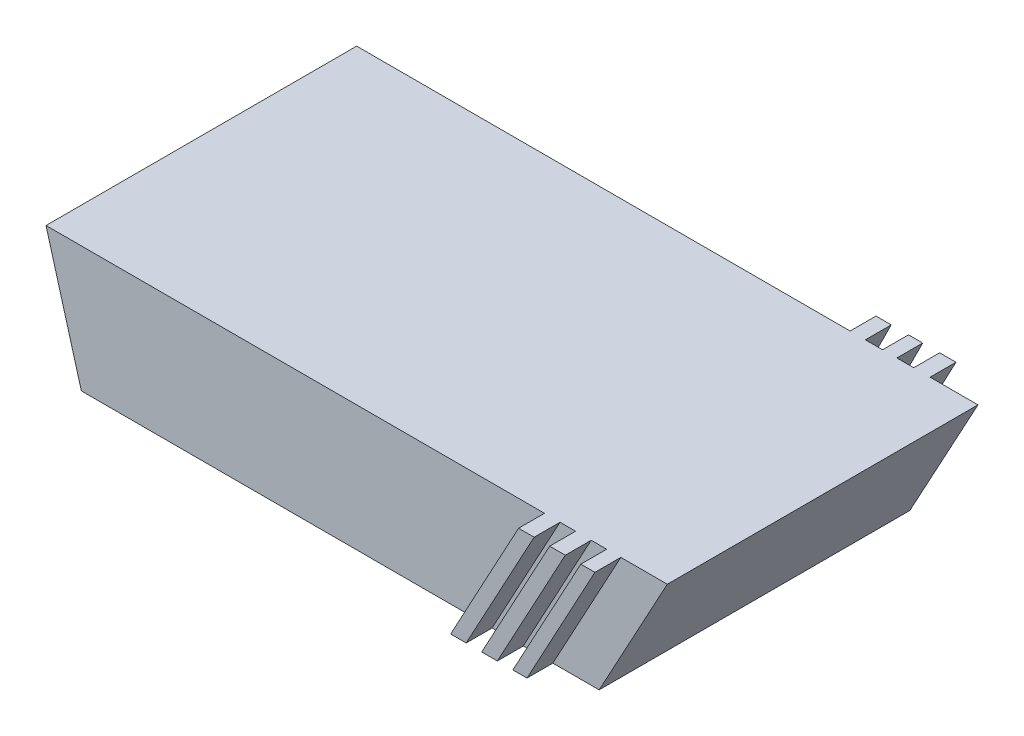
ISO-10303-21;
HEADER;
FILE_DESCRIPTION(('STEP AP214'),'2;1');
FILE_NAME('part.step','',(''),(''),'','','');
FILE_SCHEMA(('AUTOMOTIVE_DESIGN { 1 0 10303 214 1 1 1 1 }'));
ENDSEC;
DATA;
#1=APPLICATION_CONTEXT('core data for automotive mechanical design processes');
#2=APPLICATION_PROTOCOL_DEFINITION('international standard','automotive_design',2000,#1);
#3=PRODUCT_CONTEXT('',#1,'mechanical');
#4=PRODUCT('Part','Part','',(#3));
#5=PRODUCT_RELATED_PRODUCT_CATEGORY('part','',(#4));
#6=PRODUCT_DEFINITION_FORMATION('','',#4);
#7=PRODUCT_DEFINITION_CONTEXT('part definition',#1,'design');
#8=PRODUCT_DEFINITION('design','',#6,#7);
#9=PRODUCT_DEFINITION_SHAPE('','',#8);
#10=(LENGTH_UNIT() NAMED_UNIT(*) SI_UNIT(.MILLI.,.METRE.));
#11=(NAMED_UNIT(*) PLANE_ANGLE_UNIT() SI_UNIT($,.RADIAN.));
#12=(NAMED_UNIT(*) SI_UNIT($,.STERADIAN.) SOLID_ANGLE_UNIT());
#13=UNCERTAINTY_MEASURE_WITH_UNIT(LENGTH_MEASURE(1.E-05),#10,'distance_accuracy_value','');
#14=(GEOMETRIC_REPRESENTATION_CONTEXT(3) GLOBAL_UNCERTAINTY_ASSIGNED_CONTEXT((#13)) GLOBAL_UNIT_ASSIGNED_CONTEXT((#10,
#11,#12)) REPRESENTATION_CONTEXT('',''));
#15=CARTESIAN_POINT('',(0.,0.,0.));
#16=DIRECTION('',(0.,0.,1.));
#17=DIRECTION('',(1.,0.,0.));
#18=AXIS2_PLACEMENT_3D('',#15,#16,#17);
#19=CARTESIAN_POINT('',(0.,0.,0.));
#20=DIRECTION('',(0.,0.,1.));
#21=DIRECTION('',(1.,0.,0.));
#22=AXIS2_PLACEMENT_3D('',#19,#20,#21);
#23=PLANE('',#22);
#24=DIRECTION('',(0.455899375493308,0.890031324968291,0.));
#25=VECTOR('',#24,1.);
#26=CARTESIAN_POINT('',(149.796923604426,-76.7302475837124,0.));
#27=LINE('',#26,#25);
#28=CARTESIAN_POINT('',(174.135626677359,-29.2149200608947,0.));
#29=VERTEX_POINT('',#28);
#30=CARTESIAN_POINT('',(205.699290691626,32.4053654967997,0.));
#31=VERTEX_POINT('',#30);
#32=EDGE_CURVE('E569',#29,#31,#27,.T.);
#33=ORIENTED_EDGE('',*,*,#32,.F.);
#34=DIRECTION('',(1.,0.,0.));
#35=VECTOR('',#34,1.);
#36=CARTESIAN_POINT('',(-50.2295122342389,-29.2149200608947,0.));
#37=LINE('',#36,#35);
#38=CARTESIAN_POINT('',(166.529193842421,-29.2149200608947,0.));
#39=VERTEX_POINT('',#38);
#40=EDGE_CURVE('E319',#39,#29,#37,.T.);
#41=ORIENTED_EDGE('',*,*,#40,.F.);
#42=DIRECTION('',(-0.447954525543773,-0.894056342209401,0.));
#43=VECTOR('',#42,1.);
#44=CARTESIAN_POINT('',(144.813379131163,-72.5567343784887,0.));
#45=LINE('',#44,#43);
#46=CARTESIAN_POINT('',(197.403182961111,32.4053654967997,0.));
#47=VERTEX_POINT('',#46);
#48=EDGE_CURVE('E320',#47,#39,#45,.T.);
#49=ORIENTED_EDGE('',*,*,#48,.F.);
#50=DIRECTION('',(-1.,0.,0.));
#51=VECTOR('',#50,1.);
#52=CARTESIAN_POINT('',(-67.5778080595251,32.4053654967997,0.));
#53=LINE('',#52,#51);
#54=EDGE_CURVE('E393',#31,#47,#53,.T.);
#55=ORIENTED_EDGE('',*,*,#54,.F.);
#56=EDGE_LOOP('',(#33,#41,#49,#55));
#57=FACE_BOUND('',#56,.T.);
#58=ADVANCED_FACE('F109',(#57),#23,.F.);
#59=CARTESIAN_POINT('',(181.065122105022,-29.2149200608947,0.));
#60=VERTEX_POINT('',#59);
#61=CARTESIAN_POINT('',(203.770487765761,-29.2149200608947,0.));
#62=VERTEX_POINT('',#61);
#63=EDGE_CURVE('E113',#60,#62,#37,.T.);
#64=ORIENTED_EDGE('',*,*,#63,.F.);
#65=DIRECTION('',(0.46813038929932,0.883659401927274,0.));
#66=VECTOR('',#65,1.);
#67=CARTESIAN_POINT('',(153.470686029579,-81.3031489738773,0.));
#68=LINE('',#67,#66);
#69=CARTESIAN_POINT('',(213.709292702816,32.4053654967997,0.));
#70=VERTEX_POINT('',#69);
#71=EDGE_CURVE('E312',#60,#70,#68,.T.);
#72=ORIENTED_EDGE('',*,*,#71,.T.);
#73=CARTESIAN_POINT('',(237.222191940475,32.4053654967997,0.));
#74=VERTEX_POINT('',#73);
#75=EDGE_CURVE('E406',#74,#70,#53,.T.);
#76=ORIENTED_EDGE('',*,*,#75,.F.);
#77=DIRECTION('',(0.47709948611595,0.878849293307958,0.));
#78=VECTOR('',#77,1.);
#79=CARTESIAN_POINT('',(203.770487765761,-29.2149200608947,0.));
#80=LINE('',#79,#78);
#81=EDGE_CURVE('E398',#62,#74,#80,.T.);
#82=ORIENTED_EDGE('',*,*,#81,.F.);
#83=EDGE_LOOP('',(#64,#72,#76,#82));
#84=FACE_BOUND('',#83,.T.);
#85=ADVANCED_FACE('F555',(#84),#23,.F.);
#86=DIRECTION('',(0.455899375493308,0.890031324968291,0.));
#87=VECTOR('',#86,1.);
#88=CARTESIAN_POINT('',(137.698216372376,-70.5329454027311,0.));
#89=LINE('',#88,#87);
#90=CARTESIAN_POINT('',(158.86248488914,-29.2149200608947,0.));
#91=VERTEX_POINT('',#90);
#92=CARTESIAN_POINT('',(190.426148903407,32.4053654967997,0.));
#93=VERTEX_POINT('',#92);
#94=EDGE_CURVE('E322',#91,#93,#89,.T.);
#95=ORIENTED_EDGE('',*,*,#94,.F.);
#96=CARTESIAN_POINT('',(151.231941606863,-29.2149200608947,0.));
#97=VERTEX_POINT('',#96);
#98=EDGE_CURVE('E366',#97,#91,#37,.T.);
#99=ORIENTED_EDGE('',*,*,#98,.F.);
#100=DIRECTION('',(-0.446331631424027,-0.894867629758931,0.));
#101=VECTOR('',#100,1.);
#102=CARTESIAN_POINT('',(132.773400243496,-66.2231668345845,0.));
#103=LINE('',#102,#101);
#104=CARTESIAN_POINT('',(181.966188401766,32.4053654967997,0.));
#105=VERTEX_POINT('',#104);
#106=EDGE_CURVE('E346',#105,#97,#103,.T.);
#107=ORIENTED_EDGE('',*,*,#106,.F.);
#108=EDGE_CURVE('E390',#93,#105,#53,.T.);
#109=ORIENTED_EDGE('',*,*,#108,.F.);
#110=EDGE_LOOP('',(#95,#99,#107,#109));
#111=FACE_BOUND('',#110,.T.);
#112=ADVANCED_FACE('F591',(#111),#23,.F.);
#113=DIRECTION('',(0.447954525543774,0.894056342209401,0.));
#114=VECTOR('',#113,1.);
#115=CARTESIAN_POINT('',(126.494777369655,-63.3784531301023,0.));
#116=LINE('',#115,#114);
#117=CARTESIAN_POINT('',(143.611941606863,-29.2149200608947,0.));
#118=VERTEX_POINT('',#117);
#119=CARTESIAN_POINT('',(174.485930725553,32.4053654967997,0.));
#120=VERTEX_POINT('',#119);
#121=EDGE_CURVE('E351',#118,#120,#116,.T.);
#122=ORIENTED_EDGE('',*,*,#121,.F.);
#123=CARTESIAN_POINT('',(-50.2295122342389,-29.2149200608947,0.));
#124=VERTEX_POINT('',#123);
#125=EDGE_CURVE('E541',#124,#118,#37,.T.);
#126=ORIENTED_EDGE('',*,*,#125,.F.);
#127=DIRECTION('',(0.271000208820652,-0.962579288588303,0.));
#128=VECTOR('',#127,1.);
#129=CARTESIAN_POINT('',(-67.5778080595251,32.4053654967997,0.));
#130=LINE('',#129,#128);
#131=CARTESIAN_POINT('',(-67.5778080595251,32.4053654967997,0.));
#132=VERTEX_POINT('',#131);
#133=EDGE_CURVE('E438',#132,#124,#130,.T.);
#134=ORIENTED_EDGE('',*,*,#133,.F.);
#135=EDGE_CURVE('E394',#120,#132,#53,.T.);
#136=ORIENTED_EDGE('',*,*,#135,.F.);
#137=EDGE_LOOP('',(#122,#126,#134,#136));
#138=FACE_BOUND('',#137,.T.);
#139=ADVANCED_FACE('F605',(#138),#23,.F.);
#140=CARTESIAN_POINT('',(0.,0.,152.4));
#141=DIRECTION('',(0.,0.,1.));
#142=DIRECTION('',(1.,0.,0.));
#143=AXIS2_PLACEMENT_3D('',#140,#141,#142);
#144=PLANE('',#143);
#145=DIRECTION('',(-1.,0.,0.));
#146=VECTOR('',#145,1.);
#147=CARTESIAN_POINT('',(-67.5778080595251,32.4053654967997,152.4));
#148=LINE('',#147,#146);
#149=CARTESIAN_POINT('',(192.204880740534,32.4053654967997,152.4));
#150=VERTEX_POINT('',#149);
#151=CARTESIAN_POINT('',(184.574337458257,32.4053654967997,152.4));
#152=VERTEX_POINT('',#151);
#153=EDGE_CURVE('E431',#150,#152,#148,.T.);
#154=ORIENTED_EDGE('',*,*,#153,.T.);
#155=DIRECTION('',(0.475894014218418,0.879502636284327,0.));
#156=VECTOR('',#155,1.);
#157=CARTESIAN_POINT('',(151.231941606864,-29.2149200608947,152.4));
#158=LINE('',#157,#156);
#159=CARTESIAN_POINT('',(151.231941606864,-29.2149200608947,152.4));
#160=VERTEX_POINT('',#159);
#161=EDGE_CURVE('E377',#160,#152,#158,.T.);
#162=ORIENTED_EDGE('',*,*,#161,.F.);
#163=DIRECTION('',(1.,0.,0.));
#164=VECTOR('',#163,1.);
#165=CARTESIAN_POINT('',(-50.2295122342389,-29.2149200608947,152.4));
#166=LINE('',#165,#164);
#167=CARTESIAN_POINT('',(158.86248488914,-29.2149200608947,152.4));
#168=VERTEX_POINT('',#167);
#169=EDGE_CURVE('E410',#160,#168,#166,.T.);
#170=ORIENTED_EDGE('',*,*,#169,.T.);
#171=DIRECTION('',(-0.475894014218417,-0.879502636284327,0.));
#172=VECTOR('',#171,1.);
#173=CARTESIAN_POINT('',(192.204880740534,32.4053654967997,152.4));
#174=LINE('',#173,#172);
#175=EDGE_CURVE('E469',#150,#168,#174,.T.);
#176=ORIENTED_EDGE('',*,*,#175,.F.);
#177=EDGE_LOOP('',(#154,#162,#170,#176));
#178=FACE_BOUND('',#177,.T.);
#179=ADVANCED_FACE('F607',(#178),#144,.T.);
#180=CARTESIAN_POINT('',(-50.2295122342389,-29.2149200608947,152.4));
#181=VERTEX_POINT('',#180);
#182=CARTESIAN_POINT('',(143.611941606864,-29.2149200608947,152.4));
#183=VERTEX_POINT('',#182);
#184=EDGE_CURVE('E413',#181,#183,#166,.T.);
#185=ORIENTED_EDGE('',*,*,#184,.T.);
#186=DIRECTION('',(-0.475894014218418,-0.879502636284327,0.));
#187=VECTOR('',#186,1.);
#188=CARTESIAN_POINT('',(143.611941606864,-29.2149200608947,152.4));
#189=LINE('',#188,#187);
#190=CARTESIAN_POINT('',(176.954337458257,32.4053654967997,152.4));
#191=VERTEX_POINT('',#190);
#192=EDGE_CURVE('E912',#191,#183,#189,.T.);
#193=ORIENTED_EDGE('',*,*,#192,.F.);
#194=CARTESIAN_POINT('',(-67.5778080595251,32.4053654967997,152.4));
#195=VERTEX_POINT('',#194);
#196=EDGE_CURVE('E415',#191,#195,#148,.T.);
#197=ORIENTED_EDGE('',*,*,#196,.T.);
#198=DIRECTION('',(0.271000208820652,-0.962579288588303,0.));
#199=VECTOR('',#198,1.);
#200=CARTESIAN_POINT('',(-67.5778080595251,32.4053654967997,152.4));
#201=LINE('',#200,#199);
#202=EDGE_CURVE('E409',#195,#181,#201,.T.);
#203=ORIENTED_EDGE('',*,*,#202,.T.);
#204=EDGE_LOOP('',(#185,#193,#197,#203));
#205=FACE_BOUND('',#204,.T.);
#206=ADVANCED_FACE('F533',(#205),#144,.T.);
#207=CARTESIAN_POINT('',(207.478022528753,32.4053654967997,152.4));
#208=VERTEX_POINT('',#207);
#209=CARTESIAN_POINT('',(199.871589693814,32.4053654967997,152.4));
#210=VERTEX_POINT('',#209);
#211=EDGE_CURVE('E433',#208,#210,#148,.T.);
#212=ORIENTED_EDGE('',*,*,#211,.T.);
#213=DIRECTION('',(0.475894014218417,0.879502636284327,0.));
#214=VECTOR('',#213,1.);
#215=CARTESIAN_POINT('',(166.529193842421,-29.2149200608947,152.4));
#216=LINE('',#215,#214);
#217=CARTESIAN_POINT('',(166.529193842421,-29.2149200608947,152.4));
#218=VERTEX_POINT('',#217);
#219=EDGE_CURVE('E454',#218,#210,#216,.T.);
#220=ORIENTED_EDGE('',*,*,#219,.F.);
#221=CARTESIAN_POINT('',(174.135626677359,-29.2149200608947,152.4));
#222=VERTEX_POINT('',#221);
#223=EDGE_CURVE('E414',#218,#222,#166,.T.);
#224=ORIENTED_EDGE('',*,*,#223,.T.);
#225=DIRECTION('',(-0.475894014218417,-0.879502636284327,0.));
#226=VECTOR('',#225,1.);
#227=CARTESIAN_POINT('',(207.478022528753,32.4053654967997,152.4));
#228=LINE('',#227,#226);
#229=EDGE_CURVE('E457',#208,#222,#228,.T.);
#230=ORIENTED_EDGE('',*,*,#229,.F.);
#231=EDGE_LOOP('',(#212,#220,#224,#230));
#232=FACE_BOUND('',#231,.T.);
#233=ADVANCED_FACE('F453',(#232),#144,.T.);
#234=CARTESIAN_POINT('',(-67.5778080595251,32.4053654967997,152.4));
#235=DIRECTION('',(0.962579288588303,0.271000208820652,0.));
#236=DIRECTION('',(-0.271000208820652,0.962579288588303,0.));
#237=AXIS2_PLACEMENT_3D('',#234,#235,#236);
#238=PLANE('',#237);
#239=ORIENTED_EDGE('',*,*,#133,.T.);
#240=DIRECTION('',(0.,0.,-1.));
#241=VECTOR('',#240,1.);
#242=CARTESIAN_POINT('',(-50.2295122342389,-29.2149200608947,152.4));
#243=LINE('',#242,#241);
#244=EDGE_CURVE('E12',#181,#124,#243,.T.);
#245=ORIENTED_EDGE('',*,*,#244,.F.);
#246=ORIENTED_EDGE('',*,*,#202,.F.);
#247=DIRECTION('',(0.,0.,-1.));
#248=VECTOR('',#247,1.);
#249=CARTESIAN_POINT('',(-67.5778080595251,32.4053654967997,152.4));
#250=LINE('',#249,#248);
#251=EDGE_CURVE('E399',#195,#132,#250,.T.);
#252=ORIENTED_EDGE('',*,*,#251,.T.);
#253=EDGE_LOOP('',(#239,#245,#246,#252));
#254=FACE_BOUND('',#253,.T.);
#255=ADVANCED_FACE('F111',(#254),#238,.F.);
#256=CARTESIAN_POINT('',(-50.2295122342389,-29.2149200608947,152.4));
#257=DIRECTION('',(0.,1.,0.));
#258=DIRECTION('',(0.,0.,1.));
#259=AXIS2_PLACEMENT_3D('',#256,#257,#258);
#260=PLANE('',#259);
#261=ORIENTED_EDGE('',*,*,#125,.T.);
#262=DIRECTION('',(0.,0.,1.));
#263=VECTOR('',#262,1.);
#264=CARTESIAN_POINT('',(143.611941606863,-29.2149200608947,-12.7));
#265=LINE('',#264,#263);
#266=CARTESIAN_POINT('',(143.611941606863,-29.2149200608947,-12.7));
#267=VERTEX_POINT('',#266);
#268=EDGE_CURVE('E372',#267,#118,#265,.T.);
#269=ORIENTED_EDGE('',*,*,#268,.F.);
#270=DIRECTION('',(-1.,0.,0.));
#271=VECTOR('',#270,1.);
#272=CARTESIAN_POINT('',(0.,-29.2149200608947,-12.7));
#273=LINE('',#272,#271);
#274=CARTESIAN_POINT('',(151.231941606863,-29.2149200608947,-12.7));
#275=VERTEX_POINT('',#274);
#276=EDGE_CURVE('E353',#275,#267,#273,.T.);
#277=ORIENTED_EDGE('',*,*,#276,.F.);
#278=DIRECTION('',(0.,0.,1.));
#279=VECTOR('',#278,1.);
#280=CARTESIAN_POINT('',(151.231941606863,-29.2149200608947,-12.7));
#281=LINE('',#280,#279);
#282=EDGE_CURVE('E368',#275,#97,#281,.T.);
#283=ORIENTED_EDGE('',*,*,#282,.T.);
#284=ORIENTED_EDGE('',*,*,#98,.T.);
#285=DIRECTION('',(0.,0.,1.));
#286=VECTOR('',#285,1.);
#287=CARTESIAN_POINT('',(158.86248488914,-29.2149200608947,-12.7));
#288=LINE('',#287,#286);
#289=CARTESIAN_POINT('',(158.86248488914,-29.2149200608947,-12.7));
#290=VERTEX_POINT('',#289);
#291=EDGE_CURVE('E339',#290,#91,#288,.T.);
#292=ORIENTED_EDGE('',*,*,#291,.F.);
#293=DIRECTION('',(-1.,0.,0.));
#294=VECTOR('',#293,1.);
#295=CARTESIAN_POINT('',(0.,-29.2149200608947,-12.7));
#296=LINE('',#295,#294);
#297=CARTESIAN_POINT('',(166.529193842421,-29.2149200608947,-12.7));
#298=VERTEX_POINT('',#297);
#299=EDGE_CURVE('E333',#298,#290,#296,.T.);
#300=ORIENTED_EDGE('',*,*,#299,.F.);
#301=DIRECTION('',(0.,0.,1.));
#302=VECTOR('',#301,1.);
#303=CARTESIAN_POINT('',(166.529193842421,-29.2149200608947,-12.7));
#304=LINE('',#303,#302);
#305=EDGE_CURVE('E341',#298,#39,#304,.T.);
#306=ORIENTED_EDGE('',*,*,#305,.T.);
#307=ORIENTED_EDGE('',*,*,#40,.T.);
#308=DIRECTION('',(0.,0.,1.));
#309=VECTOR('',#308,1.);
#310=CARTESIAN_POINT('',(174.135626677359,-29.2149200608947,-12.7));
#311=LINE('',#310,#309);
#312=CARTESIAN_POINT('',(174.135626677359,-29.2149200608947,-12.7));
#313=VERTEX_POINT('',#312);
#314=EDGE_CURVE('E300',#313,#29,#311,.T.);
#315=ORIENTED_EDGE('',*,*,#314,.F.);
#316=DIRECTION('',(-1.,0.,0.));
#317=VECTOR('',#316,1.);
#318=CARTESIAN_POINT('',(0.,-29.2149200608947,-12.7));
#319=LINE('',#318,#317);
#320=CARTESIAN_POINT('',(181.065122105022,-29.2149200608947,-12.7));
#321=VERTEX_POINT('',#320);
#322=EDGE_CURVE('E304',#321,#313,#319,.T.);
#323=ORIENTED_EDGE('',*,*,#322,.F.);
#324=DIRECTION('',(0.,0.,1.));
#325=VECTOR('',#324,1.);
#326=CARTESIAN_POINT('',(181.065122105022,-29.2149200608947,-12.7));
#327=LINE('',#326,#325);
#328=EDGE_CURVE('E563',#321,#60,#327,.T.);
#329=ORIENTED_EDGE('',*,*,#328,.T.);
#330=ORIENTED_EDGE('',*,*,#63,.T.);
#331=DIRECTION('',(0.,0.,-1.));
#332=VECTOR('',#331,1.);
#333=CARTESIAN_POINT('',(203.770487765761,-29.2149200608947,152.4));
#334=LINE('',#333,#332);
#335=CARTESIAN_POINT('',(203.770487765761,-29.2149200608947,152.4));
#336=VERTEX_POINT('',#335);
#337=EDGE_CURVE('E119',#336,#62,#334,.T.);
#338=ORIENTED_EDGE('',*,*,#337,.F.);
#339=CARTESIAN_POINT('',(181.065122105022,-29.2149200608947,152.4));
#340=VERTEX_POINT('',#339);
#341=EDGE_CURVE('E426',#340,#336,#166,.T.);
#342=ORIENTED_EDGE('',*,*,#341,.F.);
#343=DIRECTION('',(0.,0.,-1.));
#344=VECTOR('',#343,1.);
#345=CARTESIAN_POINT('',(181.065122105022,-29.2149200608947,165.1));
#346=LINE('',#345,#344);
#347=CARTESIAN_POINT('',(181.065122105022,-29.2149200608947,165.1));
#348=VERTEX_POINT('',#347);
#349=EDGE_CURVE('E500',#348,#340,#346,.T.);
#350=ORIENTED_EDGE('',*,*,#349,.F.);
#351=DIRECTION('',(1.,0.,0.));
#352=VECTOR('',#351,1.);
#353=CARTESIAN_POINT('',(174.135626677359,-29.2149200608947,165.1));
#354=LINE('',#353,#352);
#355=CARTESIAN_POINT('',(174.135626677359,-29.2149200608947,165.1));
#356=VERTEX_POINT('',#355);
#357=EDGE_CURVE('E484',#356,#348,#354,.T.);
#358=ORIENTED_EDGE('',*,*,#357,.F.);
#359=DIRECTION('',(0.,0.,-1.));
#360=VECTOR('',#359,1.);
#361=CARTESIAN_POINT('',(174.135626677359,-29.2149200608947,165.1));
#362=LINE('',#361,#360);
#363=EDGE_CURVE('E493',#356,#222,#362,.T.);
#364=ORIENTED_EDGE('',*,*,#363,.T.);
#365=ORIENTED_EDGE('',*,*,#223,.F.);
#366=DIRECTION('',(0.,0.,-1.));
#367=VECTOR('',#366,1.);
#368=CARTESIAN_POINT('',(166.529193842421,-29.2149200608947,165.1));
#369=LINE('',#368,#367);
#370=CARTESIAN_POINT('',(166.529193842421,-29.2149200608947,165.1));
#371=VERTEX_POINT('',#370);
#372=EDGE_CURVE('E468',#371,#218,#369,.T.);
#373=ORIENTED_EDGE('',*,*,#372,.F.);
#374=DIRECTION('',(1.,0.,0.));
#375=VECTOR('',#374,1.);
#376=CARTESIAN_POINT('',(158.86248488914,-29.2149200608947,165.1));
#377=LINE('',#376,#375);
#378=CARTESIAN_POINT('',(158.86248488914,-29.2149200608947,165.1));
#379=VERTEX_POINT('',#378);
#380=EDGE_CURVE('E924',#379,#371,#377,.T.);
#381=ORIENTED_EDGE('',*,*,#380,.F.);
#382=DIRECTION('',(0.,0.,-1.));
#383=VECTOR('',#382,1.);
#384=CARTESIAN_POINT('',(158.86248488914,-29.2149200608947,165.1));
#385=LINE('',#384,#383);
#386=EDGE_CURVE('E480',#379,#168,#385,.T.);
#387=ORIENTED_EDGE('',*,*,#386,.T.);
#388=ORIENTED_EDGE('',*,*,#169,.F.);
#389=DIRECTION('',(0.,0.,-1.));
#390=VECTOR('',#389,1.);
#391=CARTESIAN_POINT('',(151.231941606864,-29.2149200608947,165.1));
#392=LINE('',#391,#390);
#393=CARTESIAN_POINT('',(151.231941606864,-29.2149200608947,165.1));
#394=VERTEX_POINT('',#393);
#395=EDGE_CURVE('E470',#394,#160,#392,.T.);
#396=ORIENTED_EDGE('',*,*,#395,.F.);
#397=DIRECTION('',(1.,0.,0.));
#398=VECTOR('',#397,1.);
#399=CARTESIAN_POINT('',(151.231941606864,-29.2149200608947,165.1));
#400=LINE('',#399,#398);
#401=CARTESIAN_POINT('',(143.611941606864,-29.2149200608947,165.1));
#402=VERTEX_POINT('',#401);
#403=EDGE_CURVE('E906',#402,#394,#400,.T.);
#404=ORIENTED_EDGE('',*,*,#403,.F.);
#405=DIRECTION('',(0.,0.,-1.));
#406=VECTOR('',#405,1.);
#407=CARTESIAN_POINT('',(143.611941606864,-29.2149200608947,165.1));
#408=LINE('',#407,#406);
#409=EDGE_CURVE('E545',#402,#183,#408,.T.);
#410=ORIENTED_EDGE('',*,*,#409,.T.);
#411=ORIENTED_EDGE('',*,*,#184,.F.);
#412=ORIENTED_EDGE('',*,*,#244,.T.);
#413=EDGE_LOOP('',(#261,#269,#277,#283,#284,#292,#300,#306,#307,#315,#323,#329,#330,#338,#342,
#350,#358,#364,#365,#373,#381,#387,#388,#396,#404,#410,#411,#412));
#414=FACE_BOUND('',#413,.T.);
#415=ADVANCED_FACE('F316',(#414),#260,.F.);
#416=CARTESIAN_POINT('',(203.770487765761,-29.2149200608947,152.4));
#417=DIRECTION('',(-0.878849293307957,0.47709948611595,0.));
#418=DIRECTION('',(-0.47709948611595,-0.878849293307957,0.));
#419=AXIS2_PLACEMENT_3D('',#416,#417,#418);
#420=PLANE('',#419);
#421=ORIENTED_EDGE('',*,*,#81,.T.);
#422=DIRECTION('',(0.,0.,-1.));
#423=VECTOR('',#422,1.);
#424=CARTESIAN_POINT('',(237.222191940475,32.4053654967997,152.4));
#425=LINE('',#424,#423);
#426=CARTESIAN_POINT('',(237.222191940475,32.4053654967997,152.4));
#427=VERTEX_POINT('',#426);
#428=EDGE_CURVE('E449',#427,#74,#425,.T.);
#429=ORIENTED_EDGE('',*,*,#428,.F.);
#430=DIRECTION('',(0.47709948611595,0.878849293307958,0.));
#431=VECTOR('',#430,1.);
#432=CARTESIAN_POINT('',(203.770487765761,-29.2149200608947,152.4));
#433=LINE('',#432,#431);
#434=EDGE_CURVE('E422',#336,#427,#433,.T.);
#435=ORIENTED_EDGE('',*,*,#434,.F.);
#436=ORIENTED_EDGE('',*,*,#337,.T.);
#437=EDGE_LOOP('',(#421,#429,#435,#436));
#438=FACE_BOUND('',#437,.T.);
#439=ADVANCED_FACE('F549',(#438),#420,.F.);
#440=CARTESIAN_POINT('',(-67.5778080595251,32.4053654967997,152.4));
#441=DIRECTION('',(0.,-1.,0.));
#442=DIRECTION('',(0.,0.,-1.));
#443=AXIS2_PLACEMENT_3D('',#440,#441,#442);
#444=PLANE('',#443);
#445=ORIENTED_EDGE('',*,*,#75,.T.);
#446=DIRECTION('',(0.,0.,1.));
#447=VECTOR('',#446,1.);
#448=CARTESIAN_POINT('',(213.709292702816,32.4053654967997,-12.7));
#449=LINE('',#448,#447);
#450=CARTESIAN_POINT('',(213.709292702816,32.4053654967997,-12.7));
#451=VERTEX_POINT('',#450);
#452=EDGE_CURVE('E324',#451,#70,#449,.T.);
#453=ORIENTED_EDGE('',*,*,#452,.F.);
#454=DIRECTION('',(1.,0.,0.));
#455=VECTOR('',#454,1.);
#456=CARTESIAN_POINT('',(0.,32.4053654967997,-12.7));
#457=LINE('',#456,#455);
#458=CARTESIAN_POINT('',(205.699290691626,32.4053654967997,-12.7));
#459=VERTEX_POINT('',#458);
#460=EDGE_CURVE('E303',#459,#451,#457,.T.);
#461=ORIENTED_EDGE('',*,*,#460,.F.);
#462=DIRECTION('',(0.,0.,1.));
#463=VECTOR('',#462,1.);
#464=CARTESIAN_POINT('',(205.699290691626,32.4053654967997,-12.7));
#465=LINE('',#464,#463);
#466=EDGE_CURVE('E127',#459,#31,#465,.T.);
#467=ORIENTED_EDGE('',*,*,#466,.T.);
#468=ORIENTED_EDGE('',*,*,#54,.T.);
#469=DIRECTION('',(0.,0.,1.));
#470=VECTOR('',#469,1.);
#471=CARTESIAN_POINT('',(197.403182961111,32.4053654967997,-12.7));
#472=LINE('',#471,#470);
#473=CARTESIAN_POINT('',(197.403182961111,32.4053654967997,-12.7));
#474=VERTEX_POINT('',#473);
#475=EDGE_CURVE('E343',#474,#47,#472,.T.);
#476=ORIENTED_EDGE('',*,*,#475,.F.);
#477=DIRECTION('',(1.,0.,0.));
#478=VECTOR('',#477,1.);
#479=CARTESIAN_POINT('',(0.,32.4053654967997,-12.7));
#480=LINE('',#479,#478);
#481=CARTESIAN_POINT('',(190.426148903407,32.4053654967997,-12.7));
#482=VERTEX_POINT('',#481);
#483=EDGE_CURVE('E328',#482,#474,#480,.T.);
#484=ORIENTED_EDGE('',*,*,#483,.F.);
#485=DIRECTION('',(0.,0.,1.));
#486=VECTOR('',#485,1.);
#487=CARTESIAN_POINT('',(190.426148903407,32.4053654967997,-12.7));
#488=LINE('',#487,#486);
#489=EDGE_CURVE('E134',#482,#93,#488,.T.);
#490=ORIENTED_EDGE('',*,*,#489,.T.);
#491=ORIENTED_EDGE('',*,*,#108,.T.);
#492=DIRECTION('',(0.,0.,1.));
#493=VECTOR('',#492,1.);
#494=CARTESIAN_POINT('',(181.966188401766,32.4053654967997,-12.7));
#495=LINE('',#494,#493);
#496=CARTESIAN_POINT('',(181.966188401766,32.4053654967997,-12.7));
#497=VERTEX_POINT('',#496);
#498=EDGE_CURVE('E371',#497,#105,#495,.T.);
#499=ORIENTED_EDGE('',*,*,#498,.F.);
#500=DIRECTION('',(1.,0.,0.));
#501=VECTOR('',#500,1.);
#502=CARTESIAN_POINT('',(0.,32.4053654967997,-12.7));
#503=LINE('',#502,#501);
#504=CARTESIAN_POINT('',(174.485930725553,32.4053654967997,-12.7));
#505=VERTEX_POINT('',#504);
#506=EDGE_CURVE('E347',#505,#497,#503,.T.);
#507=ORIENTED_EDGE('',*,*,#506,.F.);
#508=DIRECTION('',(0.,0.,1.));
#509=VECTOR('',#508,1.);
#510=CARTESIAN_POINT('',(174.485930725553,32.4053654967997,-12.7));
#511=LINE('',#510,#509);
#512=EDGE_CURVE('E357',#505,#120,#511,.T.);
#513=ORIENTED_EDGE('',*,*,#512,.T.);
#514=ORIENTED_EDGE('',*,*,#135,.T.);
#515=ORIENTED_EDGE('',*,*,#251,.F.);
#516=ORIENTED_EDGE('',*,*,#196,.F.);
#517=DIRECTION('',(0.,0.,-1.));
#518=VECTOR('',#517,1.);
#519=CARTESIAN_POINT('',(176.954337458257,32.4053654967997,165.1));
#520=LINE('',#519,#518);
#521=CARTESIAN_POINT('',(176.954337458257,32.4053654967997,165.1));
#522=VERTEX_POINT('',#521);
#523=EDGE_CURVE('E920',#522,#191,#520,.T.);
#524=ORIENTED_EDGE('',*,*,#523,.F.);
#525=DIRECTION('',(-1.,0.,0.));
#526=VECTOR('',#525,1.);
#527=CARTESIAN_POINT('',(176.954337458257,32.4053654967997,165.1));
#528=LINE('',#527,#526);
#529=CARTESIAN_POINT('',(184.574337458257,32.4053654967997,165.1));
#530=VERTEX_POINT('',#529);
#531=EDGE_CURVE('E945',#530,#522,#528,.T.);
#532=ORIENTED_EDGE('',*,*,#531,.F.);
#533=DIRECTION('',(0.,0.,-1.));
#534=VECTOR('',#533,1.);
#535=CARTESIAN_POINT('',(184.574337458257,32.4053654967997,165.1));
#536=LINE('',#535,#534);
#537=EDGE_CURVE('E917',#530,#152,#536,.T.);
#538=ORIENTED_EDGE('',*,*,#537,.T.);
#539=ORIENTED_EDGE('',*,*,#153,.F.);
#540=DIRECTION('',(0.,0.,-1.));
#541=VECTOR('',#540,1.);
#542=CARTESIAN_POINT('',(192.204880740534,32.4053654967997,165.1));
#543=LINE('',#542,#541);
#544=CARTESIAN_POINT('',(192.204880740534,32.4053654967997,165.1));
#545=VERTEX_POINT('',#544);
#546=EDGE_CURVE('E475',#545,#150,#543,.T.);
#547=ORIENTED_EDGE('',*,*,#546,.F.);
#548=DIRECTION('',(-1.,0.,0.));
#549=VECTOR('',#548,1.);
#550=CARTESIAN_POINT('',(199.871589693814,32.4053654967997,165.1));
#551=LINE('',#550,#549);
#552=CARTESIAN_POINT('',(199.871589693814,32.4053654967997,165.1));
#553=VERTEX_POINT('',#552);
#554=EDGE_CURVE('E474',#553,#545,#551,.T.);
#555=ORIENTED_EDGE('',*,*,#554,.F.);
#556=DIRECTION('',(0.,0.,-1.));
#557=VECTOR('',#556,1.);
#558=CARTESIAN_POINT('',(199.871589693814,32.4053654967997,165.1));
#559=LINE('',#558,#557);
#560=EDGE_CURVE('E465',#553,#210,#559,.T.);
#561=ORIENTED_EDGE('',*,*,#560,.T.);
#562=ORIENTED_EDGE('',*,*,#211,.F.);
#563=DIRECTION('',(0.,0.,-1.));
#564=VECTOR('',#563,1.);
#565=CARTESIAN_POINT('',(207.478022528753,32.4053654967997,165.1));
#566=LINE('',#565,#564);
#567=CARTESIAN_POINT('',(207.478022528753,32.4053654967997,165.1));
#568=VERTEX_POINT('',#567);
#569=EDGE_CURVE('E501',#568,#208,#566,.T.);
#570=ORIENTED_EDGE('',*,*,#569,.F.);
#571=DIRECTION('',(-1.,0.,0.));
#572=VECTOR('',#571,1.);
#573=CARTESIAN_POINT('',(214.407517956416,32.4053654967997,165.1));
#574=LINE('',#573,#572);
#575=CARTESIAN_POINT('',(214.407517956416,32.4053654967997,165.1));
#576=VERTEX_POINT('',#575);
#577=EDGE_CURVE('E489',#576,#568,#574,.T.);
#578=ORIENTED_EDGE('',*,*,#577,.F.);
#579=DIRECTION('',(0.,0.,-1.));
#580=VECTOR('',#579,1.);
#581=CARTESIAN_POINT('',(214.407517956416,32.4053654967997,165.1));
#582=LINE('',#581,#580);
#583=CARTESIAN_POINT('',(214.407517956416,32.4053654967997,152.4));
#584=VERTEX_POINT('',#583);
#585=EDGE_CURVE('E497',#576,#584,#582,.T.);
#586=ORIENTED_EDGE('',*,*,#585,.T.);
#587=EDGE_CURVE('E444',#427,#584,#148,.T.);
#588=ORIENTED_EDGE('',*,*,#587,.F.);
#589=ORIENTED_EDGE('',*,*,#428,.T.);
#590=EDGE_LOOP('',(#445,#453,#461,#467,#468,#476,#484,#490,#491,#499,#507,#513,#514,#515,#516,
#524,#532,#538,#539,#547,#555,#561,#562,#570,#578,#586,#588,#589));
#591=FACE_BOUND('',#590,.T.);
#592=ADVANCED_FACE('F472',(#591),#444,.F.);
#593=DIRECTION('',(0.475894014218418,0.879502636284327,0.));
#594=VECTOR('',#593,1.);
#595=CARTESIAN_POINT('',(181.065122105022,-29.2149200608947,152.4));
#596=LINE('',#595,#594);
#597=EDGE_CURVE('E477',#340,#584,#596,.T.);
#598=ORIENTED_EDGE('',*,*,#597,.F.);
#599=ORIENTED_EDGE('',*,*,#341,.T.);
#600=ORIENTED_EDGE('',*,*,#434,.T.);
#601=ORIENTED_EDGE('',*,*,#587,.T.);
#602=EDGE_LOOP('',(#598,#599,#600,#601));
#603=FACE_BOUND('',#602,.T.);
#604=ADVANCED_FACE('F525',(#603),#144,.T.);
#605=CARTESIAN_POINT('',(181.065122105022,-29.2149200608947,165.1));
#606=DIRECTION('',(-0.879502636284327,0.475894014218417,0.));
#607=DIRECTION('',(-0.475894014218418,-0.879502636284327,0.));
#608=AXIS2_PLACEMENT_3D('',#605,#606,#607);
#609=PLANE('',#608);
#610=ORIENTED_EDGE('',*,*,#597,.T.);
#611=ORIENTED_EDGE('',*,*,#585,.F.);
#612=DIRECTION('',(0.475894014218418,0.879502636284327,0.));
#613=VECTOR('',#612,1.);
#614=CARTESIAN_POINT('',(181.065122105022,-29.2149200608947,165.1));
#615=LINE('',#614,#613);
#616=EDGE_CURVE('E487',#348,#576,#615,.T.);
#617=ORIENTED_EDGE('',*,*,#616,.F.);
#618=ORIENTED_EDGE('',*,*,#349,.T.);
#619=EDGE_LOOP('',(#610,#611,#617,#618));
#620=FACE_BOUND('',#619,.T.);
#621=ADVANCED_FACE('F523',(#620),#609,.F.);
#622=CARTESIAN_POINT('',(207.478022528753,32.4053654967997,165.1));
#623=DIRECTION('',(0.879502636284327,-0.475894014218417,0.));
#624=DIRECTION('',(0.475894014218417,0.879502636284327,0.));
#625=AXIS2_PLACEMENT_3D('',#622,#623,#624);
#626=PLANE('',#625);
#627=ORIENTED_EDGE('',*,*,#229,.T.);
#628=ORIENTED_EDGE('',*,*,#363,.F.);
#629=DIRECTION('',(-0.475894014218417,-0.879502636284327,0.));
#630=VECTOR('',#629,1.);
#631=CARTESIAN_POINT('',(207.478022528753,32.4053654967997,165.1));
#632=LINE('',#631,#630);
#633=EDGE_CURVE('E491',#568,#356,#632,.T.);
#634=ORIENTED_EDGE('',*,*,#633,.F.);
#635=ORIENTED_EDGE('',*,*,#569,.T.);
#636=EDGE_LOOP('',(#627,#628,#634,#635));
#637=FACE_BOUND('',#636,.T.);
#638=ADVANCED_FACE('F514',(#637),#626,.F.);
#639=CARTESIAN_POINT('',(0.,0.,165.1));
#640=DIRECTION('',(0.,0.,1.));
#641=DIRECTION('',(1.,0.,0.));
#642=AXIS2_PLACEMENT_3D('',#639,#640,#641);
#643=PLANE('',#642);
#644=ORIENTED_EDGE('',*,*,#357,.T.);
#645=ORIENTED_EDGE('',*,*,#616,.T.);
#646=ORIENTED_EDGE('',*,*,#577,.T.);
#647=ORIENTED_EDGE('',*,*,#633,.T.);
#648=EDGE_LOOP('',(#644,#645,#646,#647));
#649=FACE_BOUND('',#648,.T.);
#650=ADVANCED_FACE('F519',(#649),#643,.T.);
#651=CARTESIAN_POINT('',(166.529193842421,-29.2149200608947,165.1));
#652=DIRECTION('',(-0.879502636284327,0.475894014218417,0.));
#653=DIRECTION('',(-0.475894014218417,-0.879502636284327,0.));
#654=AXIS2_PLACEMENT_3D('',#651,#652,#653);
#655=PLANE('',#654);
#656=ORIENTED_EDGE('',*,*,#219,.T.);
#657=ORIENTED_EDGE('',*,*,#560,.F.);
#658=DIRECTION('',(0.475894014218417,0.879502636284327,0.));
#659=VECTOR('',#658,1.);
#660=CARTESIAN_POINT('',(166.529193842421,-29.2149200608947,165.1));
#661=LINE('',#660,#659);
#662=EDGE_CURVE('E927',#371,#553,#661,.T.);
#663=ORIENTED_EDGE('',*,*,#662,.F.);
#664=ORIENTED_EDGE('',*,*,#372,.T.);
#665=EDGE_LOOP('',(#656,#657,#663,#664));
#666=FACE_BOUND('',#665,.T.);
#667=ADVANCED_FACE('F464',(#666),#655,.F.);
#668=CARTESIAN_POINT('',(192.204880740534,32.4053654967997,165.1));
#669=DIRECTION('',(0.879502636284327,-0.475894014218417,0.));
#670=DIRECTION('',(0.475894014218417,0.879502636284327,0.));
#671=AXIS2_PLACEMENT_3D('',#668,#669,#670);
#672=PLANE('',#671);
#673=ORIENTED_EDGE('',*,*,#175,.T.);
#674=ORIENTED_EDGE('',*,*,#386,.F.);
#675=DIRECTION('',(-0.475894014218417,-0.879502636284327,0.));
#676=VECTOR('',#675,1.);
#677=CARTESIAN_POINT('',(192.204880740534,32.4053654967997,165.1));
#678=LINE('',#677,#676);
#679=EDGE_CURVE('E930',#545,#379,#678,.T.);
#680=ORIENTED_EDGE('',*,*,#679,.F.);
#681=ORIENTED_EDGE('',*,*,#546,.T.);
#682=EDGE_LOOP('',(#673,#674,#680,#681));
#683=FACE_BOUND('',#682,.T.);
#684=ADVANCED_FACE('F744',(#683),#672,.F.);
#685=CARTESIAN_POINT('',(0.,0.,165.1));
#686=DIRECTION('',(0.,0.,1.));
#687=DIRECTION('',(1.,0.,0.));
#688=AXIS2_PLACEMENT_3D('',#685,#686,#687);
#689=PLANE('',#688);
#690=ORIENTED_EDGE('',*,*,#380,.T.);
#691=ORIENTED_EDGE('',*,*,#662,.T.);
#692=ORIENTED_EDGE('',*,*,#554,.T.);
#693=ORIENTED_EDGE('',*,*,#679,.T.);
#694=EDGE_LOOP('',(#690,#691,#692,#693));
#695=FACE_BOUND('',#694,.T.);
#696=ADVANCED_FACE('F751',(#695),#689,.T.);
#697=CARTESIAN_POINT('',(151.231941606864,-29.2149200608947,165.1));
#698=DIRECTION('',(-0.879502636284327,0.475894014218417,0.));
#699=DIRECTION('',(-0.475894014218418,-0.879502636284327,0.));
#700=AXIS2_PLACEMENT_3D('',#697,#698,#699);
#701=PLANE('',#700);
#702=ORIENTED_EDGE('',*,*,#161,.T.);
#703=ORIENTED_EDGE('',*,*,#537,.F.);
#704=DIRECTION('',(0.475894014218418,0.879502636284327,0.));
#705=VECTOR('',#704,1.);
#706=CARTESIAN_POINT('',(151.231941606864,-29.2149200608947,165.1));
#707=LINE('',#706,#705);
#708=EDGE_CURVE('E908',#394,#530,#707,.T.);
#709=ORIENTED_EDGE('',*,*,#708,.F.);
#710=ORIENTED_EDGE('',*,*,#395,.T.);
#711=EDGE_LOOP('',(#702,#703,#709,#710));
#712=FACE_BOUND('',#711,.T.);
#713=ADVANCED_FACE('F759',(#712),#701,.F.);
#714=CARTESIAN_POINT('',(143.611941606864,-29.2149200608947,165.1));
#715=DIRECTION('',(0.879502636284327,-0.475894014218417,0.));
#716=DIRECTION('',(0.475894014218418,0.879502636284327,0.));
#717=AXIS2_PLACEMENT_3D('',#714,#715,#716);
#718=PLANE('',#717);
#719=ORIENTED_EDGE('',*,*,#192,.T.);
#720=ORIENTED_EDGE('',*,*,#409,.F.);
#721=DIRECTION('',(-0.475894014218418,-0.879502636284327,0.));
#722=VECTOR('',#721,1.);
#723=CARTESIAN_POINT('',(143.611941606864,-29.2149200608947,165.1));
#724=LINE('',#723,#722);
#725=EDGE_CURVE('E911',#522,#402,#724,.T.);
#726=ORIENTED_EDGE('',*,*,#725,.F.);
#727=ORIENTED_EDGE('',*,*,#523,.T.);
#728=EDGE_LOOP('',(#719,#720,#726,#727));
#729=FACE_BOUND('',#728,.T.);
#730=ADVANCED_FACE('F767',(#729),#718,.F.);
#731=CARTESIAN_POINT('',(0.,0.,165.1));
#732=DIRECTION('',(0.,0.,-1.));
#733=DIRECTION('',(-1.,0.,0.));
#734=AXIS2_PLACEMENT_3D('',#731,#732,#733);
#735=PLANE('',#734);
#736=ORIENTED_EDGE('',*,*,#403,.T.);
#737=ORIENTED_EDGE('',*,*,#708,.T.);
#738=ORIENTED_EDGE('',*,*,#531,.T.);
#739=ORIENTED_EDGE('',*,*,#725,.T.);
#740=EDGE_LOOP('',(#736,#737,#738,#739));
#741=FACE_BOUND('',#740,.T.);
#742=ADVANCED_FACE('F775',(#741),#735,.F.);
#743=CARTESIAN_POINT('',(132.773400243496,-66.2231668345845,-12.7));
#744=DIRECTION('',(-0.89486762975893,0.446331631424027,0.));
#745=DIRECTION('',(-0.446331631424027,-0.894867629758931,0.));
#746=AXIS2_PLACEMENT_3D('',#743,#744,#745);
#747=PLANE('',#746);
#748=ORIENTED_EDGE('',*,*,#106,.T.);
#749=ORIENTED_EDGE('',*,*,#282,.F.);
#750=DIRECTION('',(-0.446331631424027,-0.894867629758931,0.));
#751=VECTOR('',#750,1.);
#752=CARTESIAN_POINT('',(132.773400243496,-66.2231668345845,-12.7));
#753=LINE('',#752,#751);
#754=EDGE_CURVE('E350',#497,#275,#753,.T.);
#755=ORIENTED_EDGE('',*,*,#754,.F.);
#756=ORIENTED_EDGE('',*,*,#498,.T.);
#757=EDGE_LOOP('',(#748,#749,#755,#756));
#758=FACE_BOUND('',#757,.T.);
#759=ADVANCED_FACE('F595',(#758),#747,.F.);
#760=CARTESIAN_POINT('',(126.494777369655,-63.3784531301023,-12.7));
#761=DIRECTION('',(0.8940563422094,-0.447954525543774,0.));
#762=DIRECTION('',(0.447954525543774,0.894056342209401,0.));
#763=AXIS2_PLACEMENT_3D('',#760,#761,#762);
#764=PLANE('',#763);
#765=ORIENTED_EDGE('',*,*,#121,.T.);
#766=ORIENTED_EDGE('',*,*,#512,.F.);
#767=DIRECTION('',(0.447954525543774,0.894056342209401,0.));
#768=VECTOR('',#767,1.);
#769=CARTESIAN_POINT('',(126.494777369655,-63.3784531301023,-12.7));
#770=LINE('',#769,#768);
#771=EDGE_CURVE('E355',#267,#505,#770,.T.);
#772=ORIENTED_EDGE('',*,*,#771,.F.);
#773=ORIENTED_EDGE('',*,*,#268,.T.);
#774=EDGE_LOOP('',(#765,#766,#772,#773));
#775=FACE_BOUND('',#774,.T.);
#776=ADVANCED_FACE('F603',(#775),#764,.F.);
#777=CARTESIAN_POINT('',(0.,0.,-12.7));
#778=DIRECTION('',(0.,0.,-1.));
#779=DIRECTION('',(-1.,0.,0.));
#780=AXIS2_PLACEMENT_3D('',#777,#778,#779);
#781=PLANE('',#780);
#782=ORIENTED_EDGE('',*,*,#506,.T.);
#783=ORIENTED_EDGE('',*,*,#754,.T.);
#784=ORIENTED_EDGE('',*,*,#276,.T.);
#785=ORIENTED_EDGE('',*,*,#771,.T.);
#786=EDGE_LOOP('',(#782,#783,#784,#785));
#787=FACE_BOUND('',#786,.T.);
#788=ADVANCED_FACE('F599',(#787),#781,.T.);
#789=CARTESIAN_POINT('',(144.813379131163,-72.5567343784887,-12.7));
#790=DIRECTION('',(-0.894056342209401,0.447954525543773,0.));
#791=DIRECTION('',(-0.447954525543773,-0.894056342209401,0.));
#792=AXIS2_PLACEMENT_3D('',#789,#790,#791);
#793=PLANE('',#792);
#794=ORIENTED_EDGE('',*,*,#48,.T.);
#795=ORIENTED_EDGE('',*,*,#305,.F.);
#796=DIRECTION('',(-0.447954525543773,-0.894056342209401,0.));
#797=VECTOR('',#796,1.);
#798=CARTESIAN_POINT('',(144.813379131163,-72.5567343784887,-12.7));
#799=LINE('',#798,#797);
#800=EDGE_CURVE('E331',#474,#298,#799,.T.);
#801=ORIENTED_EDGE('',*,*,#800,.F.);
#802=ORIENTED_EDGE('',*,*,#475,.T.);
#803=EDGE_LOOP('',(#794,#795,#801,#802));
#804=FACE_BOUND('',#803,.T.);
#805=ADVANCED_FACE('F579',(#804),#793,.F.);
#806=CARTESIAN_POINT('',(137.698216372376,-70.5329454027311,-12.7));
#807=DIRECTION('',(0.890031324968291,-0.455899375493308,0.));
#808=DIRECTION('',(0.455899375493308,0.890031324968291,0.));
#809=AXIS2_PLACEMENT_3D('',#806,#807,#808);
#810=PLANE('',#809);
#811=ORIENTED_EDGE('',*,*,#94,.T.);
#812=ORIENTED_EDGE('',*,*,#489,.F.);
#813=DIRECTION('',(0.455899375493308,0.890031324968291,0.));
#814=VECTOR('',#813,1.);
#815=CARTESIAN_POINT('',(137.698216372376,-70.5329454027311,-12.7));
#816=LINE('',#815,#814);
#817=EDGE_CURVE('E335',#290,#482,#816,.T.);
#818=ORIENTED_EDGE('',*,*,#817,.F.);
#819=ORIENTED_EDGE('',*,*,#291,.T.);
#820=EDGE_LOOP('',(#811,#812,#818,#819));
#821=FACE_BOUND('',#820,.T.);
#822=ADVANCED_FACE('F586',(#821),#810,.F.);
#823=CARTESIAN_POINT('',(0.,0.,-12.7));
#824=DIRECTION('',(0.,0.,-1.));
#825=DIRECTION('',(-1.,0.,0.));
#826=AXIS2_PLACEMENT_3D('',#823,#824,#825);
#827=PLANE('',#826);
#828=ORIENTED_EDGE('',*,*,#483,.T.);
#829=ORIENTED_EDGE('',*,*,#800,.T.);
#830=ORIENTED_EDGE('',*,*,#299,.T.);
#831=ORIENTED_EDGE('',*,*,#817,.T.);
#832=EDGE_LOOP('',(#828,#829,#830,#831));
#833=FACE_BOUND('',#832,.T.);
#834=ADVANCED_FACE('F583',(#833),#827,.T.);
#835=CARTESIAN_POINT('',(149.796923604426,-76.7302475837124,-12.7));
#836=DIRECTION('',(0.890031324968291,-0.455899375493308,0.));
#837=DIRECTION('',(0.455899375493308,0.890031324968291,0.));
#838=AXIS2_PLACEMENT_3D('',#835,#836,#837);
#839=PLANE('',#838);
#840=ORIENTED_EDGE('',*,*,#32,.T.);
#841=ORIENTED_EDGE('',*,*,#466,.F.);
#842=DIRECTION('',(0.455899375493308,0.890031324968291,0.));
#843=VECTOR('',#842,1.);
#844=CARTESIAN_POINT('',(149.796923604426,-76.7302475837124,-12.7));
#845=LINE('',#844,#843);
#846=EDGE_CURVE('E296',#313,#459,#845,.T.);
#847=ORIENTED_EDGE('',*,*,#846,.F.);
#848=ORIENTED_EDGE('',*,*,#314,.T.);
#849=EDGE_LOOP('',(#840,#841,#847,#848));
#850=FACE_BOUND('',#849,.T.);
#851=ADVANCED_FACE('F298',(#850),#839,.F.);
#852=CARTESIAN_POINT('',(153.470686029579,-81.3031489738773,-12.7));
#853=DIRECTION('',(0.883659401927274,-0.46813038929932,0.));
#854=DIRECTION('',(0.46813038929932,0.883659401927274,0.));
#855=AXIS2_PLACEMENT_3D('',#852,#853,#854);
#856=PLANE('',#855);
#857=ORIENTED_EDGE('',*,*,#71,.F.);
#858=ORIENTED_EDGE('',*,*,#328,.F.);
#859=DIRECTION('',(0.46813038929932,0.883659401927274,0.));
#860=VECTOR('',#859,1.);
#861=CARTESIAN_POINT('',(153.470686029579,-81.3031489738773,-12.7));
#862=LINE('',#861,#860);
#863=EDGE_CURVE('E310',#321,#451,#862,.T.);
#864=ORIENTED_EDGE('',*,*,#863,.T.);
#865=ORIENTED_EDGE('',*,*,#452,.T.);
#866=EDGE_LOOP('',(#857,#858,#864,#865));
#867=FACE_BOUND('',#866,.T.);
#868=ADVANCED_FACE('F567',(#867),#856,.T.);
#869=CARTESIAN_POINT('',(0.,0.,-12.7));
#870=DIRECTION('',(0.,0.,-1.));
#871=DIRECTION('',(-1.,0.,0.));
#872=AXIS2_PLACEMENT_3D('',#869,#870,#871);
#873=PLANE('',#872);
#874=ORIENTED_EDGE('',*,*,#322,.T.);
#875=ORIENTED_EDGE('',*,*,#846,.T.);
#876=ORIENTED_EDGE('',*,*,#460,.T.);
#877=ORIENTED_EDGE('',*,*,#863,.F.);
#878=EDGE_LOOP('',(#874,#875,#876,#877));
#879=FACE_BOUND('',#878,.T.);
#880=ADVANCED_FACE('F308',(#879),#873,.T.);
#881=CLOSED_SHELL('',(#58,#85,#112,#139,#179,#206,#233,#255,#415,#439,#592,#604,#621,#638,#650,
#667,#684,#696,#713,#730,#742,#759,#776,#788,#805,#822,#834,#851,#868,#880));
#882=MANIFOLD_SOLID_BREP('B2',#881);
#883=ADVANCED_BREP_SHAPE_REPRESENTATION('',(#18,#882),#14);
#884=SHAPE_DEFINITION_REPRESENTATION(#9,#883);
ENDSEC;
END-ISO-10303-21;
